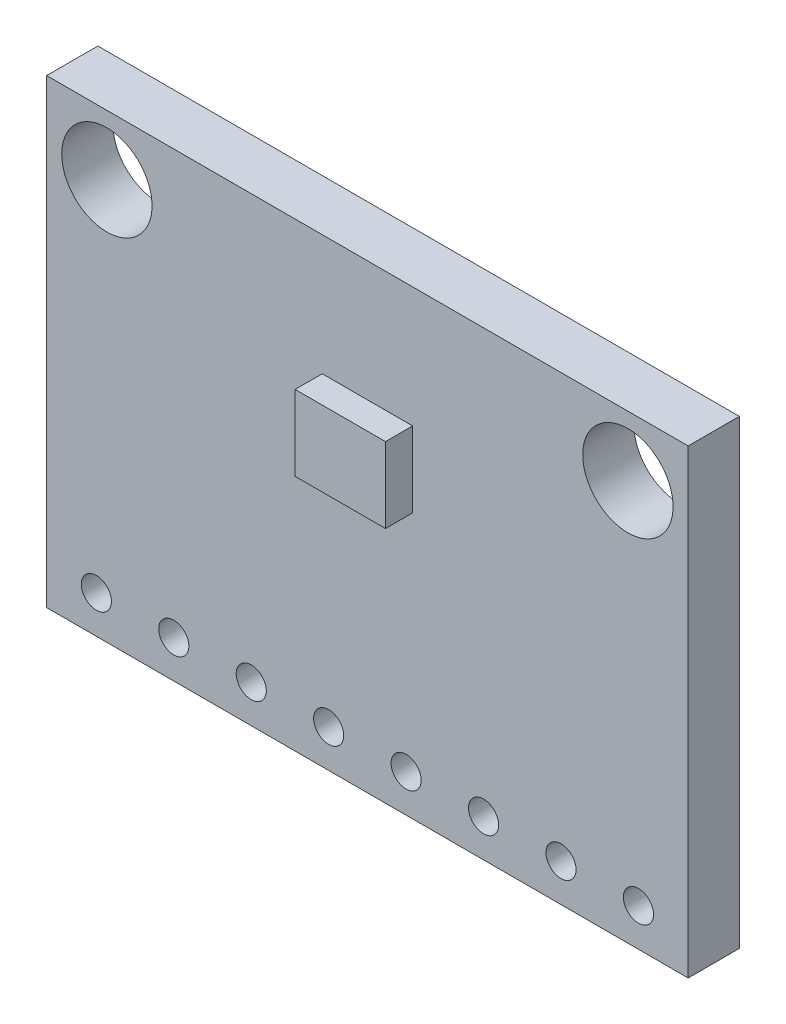
ISO-10303-21;
HEADER;
FILE_DESCRIPTION(('STEP AP214'),'2;1');
FILE_NAME('part.step','',(''),(''),'','','');
FILE_SCHEMA(('AUTOMOTIVE_DESIGN { 1 0 10303 214 1 1 1 1 }'));
ENDSEC;
DATA;
#1=APPLICATION_CONTEXT('core data for automotive mechanical design processes');
#2=APPLICATION_PROTOCOL_DEFINITION('international standard','automotive_design',2000,#1);
#3=PRODUCT_CONTEXT('',#1,'mechanical');
#4=PRODUCT('Part','Part','',(#3));
#5=PRODUCT_RELATED_PRODUCT_CATEGORY('part','',(#4));
#6=PRODUCT_DEFINITION_FORMATION('','',#4);
#7=PRODUCT_DEFINITION_CONTEXT('part definition',#1,'design');
#8=PRODUCT_DEFINITION('design','',#6,#7);
#9=PRODUCT_DEFINITION_SHAPE('','',#8);
#10=(LENGTH_UNIT() NAMED_UNIT(*) SI_UNIT(.MILLI.,.METRE.));
#11=(NAMED_UNIT(*) PLANE_ANGLE_UNIT() SI_UNIT($,.RADIAN.));
#12=(NAMED_UNIT(*) SI_UNIT($,.STERADIAN.) SOLID_ANGLE_UNIT());
#13=UNCERTAINTY_MEASURE_WITH_UNIT(LENGTH_MEASURE(1.E-05),#10,'distance_accuracy_value','');
#14=(GEOMETRIC_REPRESENTATION_CONTEXT(3) GLOBAL_UNCERTAINTY_ASSIGNED_CONTEXT((#13)) GLOBAL_UNIT_ASSIGNED_CONTEXT((#10,
#11,#12)) REPRESENTATION_CONTEXT('',''));
#15=CARTESIAN_POINT('',(0.,0.,0.));
#16=DIRECTION('',(0.,0.,1.));
#17=DIRECTION('',(1.,0.,0.));
#18=AXIS2_PLACEMENT_3D('',#15,#16,#17);
#19=CARTESIAN_POINT('',(0.,0.,1.7));
#20=DIRECTION('',(0.,0.,-1.));
#21=DIRECTION('',(-1.,0.,0.));
#22=AXIS2_PLACEMENT_3D('',#19,#20,#21);
#23=PLANE('',#22);
#24=CARTESIAN_POINT('',(6.42857142857143,-6.4,1.7));
#25=DIRECTION('',(0.,0.,-1.));
#26=DIRECTION('',(-1.,0.,0.));
#27=AXIS2_PLACEMENT_3D('',#24,#25,#26);
#28=CIRCLE('',#27,0.500000000000002);
#29=CARTESIAN_POINT('',(5.92857142857143,-6.4,1.7));
#30=VERTEX_POINT('',#29);
#31=EDGE_CURVE('E247',#30,#30,#28,.F.);
#32=ORIENTED_EDGE('',*,*,#31,.F.);
#33=EDGE_LOOP('',(#32));
#34=FACE_BOUND('',#33,.T.);
#35=CARTESIAN_POINT('',(1.28571428571429,-6.4,1.7));
#36=DIRECTION('',(0.,0.,-1.));
#37=DIRECTION('',(-1.,0.,0.));
#38=AXIS2_PLACEMENT_3D('',#35,#36,#37);
#39=CIRCLE('',#38,0.500000000000001);
#40=CARTESIAN_POINT('',(0.785714285714285,-6.4,1.7));
#41=VERTEX_POINT('',#40);
#42=EDGE_CURVE('E242',#41,#41,#39,.F.);
#43=ORIENTED_EDGE('',*,*,#42,.F.);
#44=EDGE_LOOP('',(#43));
#45=FACE_BOUND('',#44,.T.);
#46=CARTESIAN_POINT('',(-1.28571428571429,-6.4,1.7));
#47=DIRECTION('',(0.,0.,-1.));
#48=DIRECTION('',(-1.,0.,0.));
#49=AXIS2_PLACEMENT_3D('',#46,#47,#48);
#50=CIRCLE('',#49,0.500000000000001);
#51=CARTESIAN_POINT('',(-1.78571428571429,-6.4,1.7));
#52=VERTEX_POINT('',#51);
#53=EDGE_CURVE('E239',#52,#52,#50,.F.);
#54=ORIENTED_EDGE('',*,*,#53,.F.);
#55=EDGE_LOOP('',(#54));
#56=FACE_BOUND('',#55,.T.);
#57=CARTESIAN_POINT('',(-3.85714285714286,-6.4,1.7));
#58=DIRECTION('',(0.,0.,-1.));
#59=DIRECTION('',(-1.,0.,0.));
#60=AXIS2_PLACEMENT_3D('',#57,#58,#59);
#61=CIRCLE('',#60,0.500000000000001);
#62=CARTESIAN_POINT('',(-4.35714285714286,-6.4,1.7));
#63=VERTEX_POINT('',#62);
#64=EDGE_CURVE('E235',#63,#63,#61,.F.);
#65=ORIENTED_EDGE('',*,*,#64,.F.);
#66=EDGE_LOOP('',(#65));
#67=FACE_BOUND('',#66,.T.);
#68=CARTESIAN_POINT('',(-6.42857142857143,-6.4,1.7));
#69=DIRECTION('',(0.,0.,-1.));
#70=DIRECTION('',(-1.,0.,0.));
#71=AXIS2_PLACEMENT_3D('',#68,#69,#70);
#72=CIRCLE('',#71,0.500000000000002);
#73=CARTESIAN_POINT('',(-6.92857142857143,-6.4,1.7));
#74=VERTEX_POINT('',#73);
#75=EDGE_CURVE('E229',#74,#74,#72,.F.);
#76=ORIENTED_EDGE('',*,*,#75,.F.);
#77=EDGE_LOOP('',(#76));
#78=FACE_BOUND('',#77,.T.);
#79=CARTESIAN_POINT('',(-9.,-6.4,1.7));
#80=DIRECTION('',(0.,0.,-1.));
#81=DIRECTION('',(-1.,0.,0.));
#82=AXIS2_PLACEMENT_3D('',#79,#80,#81);
#83=CIRCLE('',#82,0.500000000000003);
#84=CARTESIAN_POINT('',(-9.5,-6.4,1.7));
#85=VERTEX_POINT('',#84);
#86=EDGE_CURVE('E225',#85,#85,#83,.F.);
#87=ORIENTED_EDGE('',*,*,#86,.F.);
#88=EDGE_LOOP('',(#87));
#89=FACE_BOUND('',#88,.T.);
#90=DIRECTION('',(0.,-1.,0.));
#91=VECTOR('',#90,1.);
#92=CARTESIAN_POINT('',(-1.5,0.,1.7));
#93=LINE('',#92,#91);
#94=CARTESIAN_POINT('',(-1.5,3.65,1.7));
#95=VERTEX_POINT('',#94);
#96=CARTESIAN_POINT('',(-1.5,1.15,1.7));
#97=VERTEX_POINT('',#96);
#98=EDGE_CURVE('E67',#95,#97,#93,.T.);
#99=ORIENTED_EDGE('',*,*,#98,.F.);
#100=DIRECTION('',(1.,0.,0.));
#101=VECTOR('',#100,1.);
#102=CARTESIAN_POINT('',(0.,3.65,1.7));
#103=LINE('',#102,#101);
#104=CARTESIAN_POINT('',(1.5,3.65,1.7));
#105=VERTEX_POINT('',#104);
#106=EDGE_CURVE('E75',#95,#105,#103,.T.);
#107=ORIENTED_EDGE('',*,*,#106,.T.);
#108=DIRECTION('',(0.,-1.,0.));
#109=VECTOR('',#108,1.);
#110=CARTESIAN_POINT('',(1.5,0.,1.7));
#111=LINE('',#110,#109);
#112=CARTESIAN_POINT('',(1.5,1.15,1.7));
#113=VERTEX_POINT('',#112);
#114=EDGE_CURVE('E261',#105,#113,#111,.T.);
#115=ORIENTED_EDGE('',*,*,#114,.T.);
#116=DIRECTION('',(1.,0.,0.));
#117=VECTOR('',#116,1.);
#118=CARTESIAN_POINT('',(0.,1.15,1.7));
#119=LINE('',#118,#117);
#120=EDGE_CURVE('E256',#97,#113,#119,.T.);
#121=ORIENTED_EDGE('',*,*,#120,.F.);
#122=EDGE_LOOP('',(#99,#107,#115,#121));
#123=FACE_BOUND('',#122,.T.);
#124=DIRECTION('',(1.,0.,0.));
#125=VECTOR('',#124,1.);
#126=CARTESIAN_POINT('',(-10.65,7.65,1.7));
#127=LINE('',#126,#125);
#128=CARTESIAN_POINT('',(-10.65,7.65,1.7));
#129=VERTEX_POINT('',#128);
#130=CARTESIAN_POINT('',(10.65,7.65,1.7));
#131=VERTEX_POINT('',#130);
#132=EDGE_CURVE('E151',#129,#131,#127,.T.);
#133=ORIENTED_EDGE('',*,*,#132,.F.);
#134=DIRECTION('',(0.,-1.,0.));
#135=VECTOR('',#134,1.);
#136=CARTESIAN_POINT('',(-10.65,7.65,1.7));
#137=LINE('',#136,#135);
#138=CARTESIAN_POINT('',(-10.65,-7.65,1.7));
#139=VERTEX_POINT('',#138);
#140=EDGE_CURVE('E162',#129,#139,#137,.T.);
#141=ORIENTED_EDGE('',*,*,#140,.T.);
#142=DIRECTION('',(1.,0.,0.));
#143=VECTOR('',#142,1.);
#144=CARTESIAN_POINT('',(-10.65,-7.65,1.7));
#145=LINE('',#144,#143);
#146=CARTESIAN_POINT('',(10.65,-7.65,1.7));
#147=VERTEX_POINT('',#146);
#148=EDGE_CURVE('E159',#139,#147,#145,.T.);
#149=ORIENTED_EDGE('',*,*,#148,.T.);
#150=DIRECTION('',(0.,-1.,0.));
#151=VECTOR('',#150,1.);
#152=CARTESIAN_POINT('',(10.65,7.65,1.7));
#153=LINE('',#152,#151);
#154=EDGE_CURVE('E154',#131,#147,#153,.T.);
#155=ORIENTED_EDGE('',*,*,#154,.F.);
#156=EDGE_LOOP('',(#133,#141,#149,#155));
#157=FACE_BOUND('',#156,.T.);
#158=CARTESIAN_POINT('',(3.85714285714286,-6.4,1.7));
#159=DIRECTION('',(0.,0.,-1.));
#160=DIRECTION('',(-1.,0.,0.));
#161=AXIS2_PLACEMENT_3D('',#158,#159,#160);
#162=CIRCLE('',#161,0.500000000000001);
#163=CARTESIAN_POINT('',(3.35714285714286,-6.4,1.7));
#164=VERTEX_POINT('',#163);
#165=EDGE_CURVE('E208',#164,#164,#162,.F.);
#166=ORIENTED_EDGE('',*,*,#165,.F.);
#167=EDGE_LOOP('',(#166));
#168=FACE_BOUND('',#167,.T.);
#169=CARTESIAN_POINT('',(9.,-6.4,1.7));
#170=DIRECTION('',(0.,0.,-1.));
#171=DIRECTION('',(-1.,0.,0.));
#172=AXIS2_PLACEMENT_3D('',#169,#170,#171);
#173=CIRCLE('',#172,0.500000000000003);
#174=CARTESIAN_POINT('',(8.5,-6.4,1.7));
#175=VERTEX_POINT('',#174);
#176=EDGE_CURVE('E215',#175,#175,#173,.F.);
#177=ORIENTED_EDGE('',*,*,#176,.F.);
#178=EDGE_LOOP('',(#177));
#179=FACE_BOUND('',#178,.T.);
#180=CARTESIAN_POINT('',(-8.65,5.65,1.7));
#181=DIRECTION('',(0.,0.,-1.));
#182=DIRECTION('',(-1.,0.,0.));
#183=AXIS2_PLACEMENT_3D('',#180,#181,#182);
#184=CIRCLE('',#183,1.5);
#185=CARTESIAN_POINT('',(-10.15,5.65,1.7));
#186=VERTEX_POINT('',#185);
#187=EDGE_CURVE('E216',#186,#186,#184,.F.);
#188=ORIENTED_EDGE('',*,*,#187,.F.);
#189=EDGE_LOOP('',(#188));
#190=FACE_BOUND('',#189,.T.);
#191=CARTESIAN_POINT('',(8.65,5.65,1.7));
#192=DIRECTION('',(0.,0.,-1.));
#193=DIRECTION('',(-1.,0.,0.));
#194=AXIS2_PLACEMENT_3D('',#191,#192,#193);
#195=CIRCLE('',#194,1.5);
#196=CARTESIAN_POINT('',(7.15,5.65,1.7));
#197=VERTEX_POINT('',#196);
#198=EDGE_CURVE('E218',#197,#197,#195,.T.);
#199=ORIENTED_EDGE('',*,*,#198,.T.);
#200=EDGE_LOOP('',(#199));
#201=FACE_BOUND('',#200,.T.);
#202=ADVANCED_FACE('F47',(#34,#45,#56,#67,#78,#89,#123,#157,#168,#179,#190,#201),#23,.F.);
#203=CARTESIAN_POINT('',(0.,0.,0.));
#204=DIRECTION('',(0.,0.,-1.));
#205=DIRECTION('',(-1.,0.,0.));
#206=AXIS2_PLACEMENT_3D('',#203,#204,#205);
#207=PLANE('',#206);
#208=CARTESIAN_POINT('',(6.42857142857143,-6.4,0.));
#209=DIRECTION('',(0.,0.,1.));
#210=DIRECTION('',(1.,0.,0.));
#211=AXIS2_PLACEMENT_3D('',#208,#209,#210);
#212=CIRCLE('',#211,0.500000000000002);
#213=CARTESIAN_POINT('',(6.92857142857143,-6.4,0.));
#214=VERTEX_POINT('',#213);
#215=EDGE_CURVE('E447',#214,#214,#212,.T.);
#216=ORIENTED_EDGE('',*,*,#215,.T.);
#217=EDGE_LOOP('',(#216));
#218=FACE_BOUND('',#217,.T.);
#219=CARTESIAN_POINT('',(1.28571428571429,-6.4,0.));
#220=DIRECTION('',(0.,0.,1.));
#221=DIRECTION('',(1.,0.,0.));
#222=AXIS2_PLACEMENT_3D('',#219,#220,#221);
#223=CIRCLE('',#222,0.500000000000001);
#224=CARTESIAN_POINT('',(1.78571428571429,-6.4,0.));
#225=VERTEX_POINT('',#224);
#226=EDGE_CURVE('E466',#225,#225,#223,.T.);
#227=ORIENTED_EDGE('',*,*,#226,.T.);
#228=EDGE_LOOP('',(#227));
#229=FACE_BOUND('',#228,.T.);
#230=CARTESIAN_POINT('',(-1.28571428571429,-6.4,0.));
#231=DIRECTION('',(0.,0.,1.));
#232=DIRECTION('',(1.,0.,0.));
#233=AXIS2_PLACEMENT_3D('',#230,#231,#232);
#234=CIRCLE('',#233,0.500000000000001);
#235=CARTESIAN_POINT('',(-0.785714285714285,-6.4,0.));
#236=VERTEX_POINT('',#235);
#237=EDGE_CURVE('E472',#236,#236,#234,.T.);
#238=ORIENTED_EDGE('',*,*,#237,.T.);
#239=EDGE_LOOP('',(#238));
#240=FACE_BOUND('',#239,.T.);
#241=CARTESIAN_POINT('',(-3.85714285714286,-6.4,0.));
#242=DIRECTION('',(0.,0.,1.));
#243=DIRECTION('',(1.,0.,0.));
#244=AXIS2_PLACEMENT_3D('',#241,#242,#243);
#245=CIRCLE('',#244,0.500000000000001);
#246=CARTESIAN_POINT('',(-3.35714285714286,-6.4,0.));
#247=VERTEX_POINT('',#246);
#248=EDGE_CURVE('E494',#247,#247,#245,.T.);
#249=ORIENTED_EDGE('',*,*,#248,.T.);
#250=EDGE_LOOP('',(#249));
#251=FACE_BOUND('',#250,.T.);
#252=CARTESIAN_POINT('',(-6.42857142857143,-6.4,0.));
#253=DIRECTION('',(0.,0.,1.));
#254=DIRECTION('',(1.,0.,0.));
#255=AXIS2_PLACEMENT_3D('',#252,#253,#254);
#256=CIRCLE('',#255,0.500000000000002);
#257=CARTESIAN_POINT('',(-5.92857142857143,-6.4,0.));
#258=VERTEX_POINT('',#257);
#259=EDGE_CURVE('E491',#258,#258,#256,.T.);
#260=ORIENTED_EDGE('',*,*,#259,.T.);
#261=EDGE_LOOP('',(#260));
#262=FACE_BOUND('',#261,.T.);
#263=CARTESIAN_POINT('',(-9.,-6.4,0.));
#264=DIRECTION('',(0.,0.,1.));
#265=DIRECTION('',(1.,0.,0.));
#266=AXIS2_PLACEMENT_3D('',#263,#264,#265);
#267=CIRCLE('',#266,0.500000000000003);
#268=CARTESIAN_POINT('',(-8.5,-6.4,0.));
#269=VERTEX_POINT('',#268);
#270=EDGE_CURVE('E490',#269,#269,#267,.T.);
#271=ORIENTED_EDGE('',*,*,#270,.T.);
#272=EDGE_LOOP('',(#271));
#273=FACE_BOUND('',#272,.T.);
#274=CARTESIAN_POINT('',(-8.65,5.65,0.));
#275=DIRECTION('',(0.,0.,1.));
#276=DIRECTION('',(1.,0.,0.));
#277=AXIS2_PLACEMENT_3D('',#274,#275,#276);
#278=CIRCLE('',#277,1.5);
#279=CARTESIAN_POINT('',(-7.15,5.65,0.));
#280=VERTEX_POINT('',#279);
#281=EDGE_CURVE('E476',#280,#280,#278,.T.);
#282=ORIENTED_EDGE('',*,*,#281,.T.);
#283=EDGE_LOOP('',(#282));
#284=FACE_BOUND('',#283,.T.);
#285=CARTESIAN_POINT('',(9.,-6.4,0.));
#286=DIRECTION('',(0.,0.,1.));
#287=DIRECTION('',(1.,0.,0.));
#288=AXIS2_PLACEMENT_3D('',#285,#286,#287);
#289=CIRCLE('',#288,0.500000000000003);
#290=CARTESIAN_POINT('',(9.5,-6.4,0.));
#291=VERTEX_POINT('',#290);
#292=EDGE_CURVE('E467',#291,#291,#289,.T.);
#293=ORIENTED_EDGE('',*,*,#292,.T.);
#294=EDGE_LOOP('',(#293));
#295=FACE_BOUND('',#294,.T.);
#296=CARTESIAN_POINT('',(3.85714285714286,-6.4,0.));
#297=DIRECTION('',(0.,0.,1.));
#298=DIRECTION('',(1.,0.,0.));
#299=AXIS2_PLACEMENT_3D('',#296,#297,#298);
#300=CIRCLE('',#299,0.500000000000001);
#301=CARTESIAN_POINT('',(4.35714285714286,-6.4,0.));
#302=VERTEX_POINT('',#301);
#303=EDGE_CURVE('E485',#302,#302,#300,.T.);
#304=ORIENTED_EDGE('',*,*,#303,.T.);
#305=EDGE_LOOP('',(#304));
#306=FACE_BOUND('',#305,.T.);
#307=DIRECTION('',(1.,0.,0.));
#308=VECTOR('',#307,1.);
#309=CARTESIAN_POINT('',(-10.65,7.65,0.));
#310=LINE('',#309,#308);
#311=CARTESIAN_POINT('',(-10.65,7.65,0.));
#312=VERTEX_POINT('',#311);
#313=CARTESIAN_POINT('',(10.65,7.65,0.));
#314=VERTEX_POINT('',#313);
#315=EDGE_CURVE('E140',#312,#314,#310,.T.);
#316=ORIENTED_EDGE('',*,*,#315,.T.);
#317=DIRECTION('',(0.,-1.,0.));
#318=VECTOR('',#317,1.);
#319=CARTESIAN_POINT('',(10.65,7.65,0.));
#320=LINE('',#319,#318);
#321=CARTESIAN_POINT('',(10.65,-7.65,0.));
#322=VERTEX_POINT('',#321);
#323=EDGE_CURVE('E144',#314,#322,#320,.T.);
#324=ORIENTED_EDGE('',*,*,#323,.T.);
#325=DIRECTION('',(1.,0.,0.));
#326=VECTOR('',#325,1.);
#327=CARTESIAN_POINT('',(-10.65,-7.65,0.));
#328=LINE('',#327,#326);
#329=CARTESIAN_POINT('',(-10.65,-7.65,0.));
#330=VERTEX_POINT('',#329);
#331=EDGE_CURVE('E166',#330,#322,#328,.T.);
#332=ORIENTED_EDGE('',*,*,#331,.F.);
#333=DIRECTION('',(0.,-1.,0.));
#334=VECTOR('',#333,1.);
#335=CARTESIAN_POINT('',(-10.65,7.65,0.));
#336=LINE('',#335,#334);
#337=EDGE_CURVE('E156',#312,#330,#336,.T.);
#338=ORIENTED_EDGE('',*,*,#337,.F.);
#339=EDGE_LOOP('',(#316,#324,#332,#338));
#340=FACE_BOUND('',#339,.T.);
#341=CARTESIAN_POINT('',(8.65,5.65,0.));
#342=DIRECTION('',(0.,0.,-1.));
#343=DIRECTION('',(-1.,0.,0.));
#344=AXIS2_PLACEMENT_3D('',#341,#342,#343);
#345=CIRCLE('',#344,1.5);
#346=CARTESIAN_POINT('',(7.15,5.65,0.));
#347=VERTEX_POINT('',#346);
#348=EDGE_CURVE('E483',#347,#347,#345,.T.);
#349=ORIENTED_EDGE('',*,*,#348,.F.);
#350=EDGE_LOOP('',(#349));
#351=FACE_BOUND('',#350,.T.);
#352=ADVANCED_FACE('F191',(#218,#229,#240,#251,#262,#273,#284,#295,#306,#340,#351),#207,.T.);
#353=CARTESIAN_POINT('',(-10.65,7.65,1.7));
#354=DIRECTION('',(0.,1.,0.));
#355=DIRECTION('',(-1.,0.,0.));
#356=AXIS2_PLACEMENT_3D('',#353,#354,#355);
#357=PLANE('',#356);
#358=ORIENTED_EDGE('',*,*,#315,.F.);
#359=DIRECTION('',(0.,0.,-1.));
#360=VECTOR('',#359,1.);
#361=CARTESIAN_POINT('',(-10.65,7.65,1.7));
#362=LINE('',#361,#360);
#363=EDGE_CURVE('E11',#129,#312,#362,.T.);
#364=ORIENTED_EDGE('',*,*,#363,.F.);
#365=ORIENTED_EDGE('',*,*,#132,.T.);
#366=DIRECTION('',(0.,0.,-1.));
#367=VECTOR('',#366,1.);
#368=CARTESIAN_POINT('',(10.65,7.65,1.7));
#369=LINE('',#368,#367);
#370=EDGE_CURVE('E52',#131,#314,#369,.T.);
#371=ORIENTED_EDGE('',*,*,#370,.T.);
#372=EDGE_LOOP('',(#358,#364,#365,#371));
#373=FACE_BOUND('',#372,.T.);
#374=ADVANCED_FACE('F51',(#373),#357,.T.);
#375=CARTESIAN_POINT('',(-10.65,7.65,1.7));
#376=DIRECTION('',(1.,0.,0.));
#377=DIRECTION('',(0.,1.,0.));
#378=AXIS2_PLACEMENT_3D('',#375,#376,#377);
#379=PLANE('',#378);
#380=ORIENTED_EDGE('',*,*,#337,.T.);
#381=DIRECTION('',(0.,0.,-1.));
#382=VECTOR('',#381,1.);
#383=CARTESIAN_POINT('',(-10.65,-7.65,1.7));
#384=LINE('',#383,#382);
#385=EDGE_CURVE('E56',#139,#330,#384,.T.);
#386=ORIENTED_EDGE('',*,*,#385,.F.);
#387=ORIENTED_EDGE('',*,*,#140,.F.);
#388=ORIENTED_EDGE('',*,*,#363,.T.);
#389=EDGE_LOOP('',(#380,#386,#387,#388));
#390=FACE_BOUND('',#389,.T.);
#391=ADVANCED_FACE('F195',(#390),#379,.F.);
#392=CARTESIAN_POINT('',(-10.65,-7.65,1.7));
#393=DIRECTION('',(0.,1.,0.));
#394=DIRECTION('',(-1.,0.,0.));
#395=AXIS2_PLACEMENT_3D('',#392,#393,#394);
#396=PLANE('',#395);
#397=ORIENTED_EDGE('',*,*,#331,.T.);
#398=DIRECTION('',(0.,0.,-1.));
#399=VECTOR('',#398,1.);
#400=CARTESIAN_POINT('',(10.65,-7.65,1.7));
#401=LINE('',#400,#399);
#402=EDGE_CURVE('E177',#147,#322,#401,.T.);
#403=ORIENTED_EDGE('',*,*,#402,.F.);
#404=ORIENTED_EDGE('',*,*,#148,.F.);
#405=ORIENTED_EDGE('',*,*,#385,.T.);
#406=EDGE_LOOP('',(#397,#403,#404,#405));
#407=FACE_BOUND('',#406,.T.);
#408=ADVANCED_FACE('F200',(#407),#396,.F.);
#409=CARTESIAN_POINT('',(10.65,7.65,1.7));
#410=DIRECTION('',(1.,0.,0.));
#411=DIRECTION('',(0.,1.,0.));
#412=AXIS2_PLACEMENT_3D('',#409,#410,#411);
#413=PLANE('',#412);
#414=ORIENTED_EDGE('',*,*,#323,.F.);
#415=ORIENTED_EDGE('',*,*,#370,.F.);
#416=ORIENTED_EDGE('',*,*,#154,.T.);
#417=ORIENTED_EDGE('',*,*,#402,.T.);
#418=EDGE_LOOP('',(#414,#415,#416,#417));
#419=FACE_BOUND('',#418,.T.);
#420=ADVANCED_FACE('F189',(#419),#413,.T.);
#421=CARTESIAN_POINT('',(-1.5,0.,2.6));
#422=DIRECTION('',(1.,0.,0.));
#423=DIRECTION('',(0.,0.,-1.));
#424=AXIS2_PLACEMENT_3D('',#421,#422,#423);
#425=PLANE('',#424);
#426=ORIENTED_EDGE('',*,*,#98,.T.);
#427=DIRECTION('',(0.,0.,-1.));
#428=VECTOR('',#427,1.);
#429=CARTESIAN_POINT('',(-1.5,1.15,2.6));
#430=LINE('',#429,#428);
#431=CARTESIAN_POINT('',(-1.5,1.15,2.6));
#432=VERTEX_POINT('',#431);
#433=EDGE_CURVE('E116',#432,#97,#430,.T.);
#434=ORIENTED_EDGE('',*,*,#433,.F.);
#435=DIRECTION('',(0.,-1.,0.));
#436=VECTOR('',#435,1.);
#437=CARTESIAN_POINT('',(-1.5,0.,2.6));
#438=LINE('',#437,#436);
#439=CARTESIAN_POINT('',(-1.5,3.65,2.6));
#440=VERTEX_POINT('',#439);
#441=EDGE_CURVE('E126',#440,#432,#438,.T.);
#442=ORIENTED_EDGE('',*,*,#441,.F.);
#443=DIRECTION('',(0.,0.,-1.));
#444=VECTOR('',#443,1.);
#445=CARTESIAN_POINT('',(-1.5,3.65,2.6));
#446=LINE('',#445,#444);
#447=EDGE_CURVE('E254',#440,#95,#446,.T.);
#448=ORIENTED_EDGE('',*,*,#447,.T.);
#449=EDGE_LOOP('',(#426,#434,#442,#448));
#450=FACE_BOUND('',#449,.T.);
#451=ADVANCED_FACE('F139',(#450),#425,.F.);
#452=CARTESIAN_POINT('',(0.,1.15,2.6));
#453=DIRECTION('',(0.,1.,0.));
#454=DIRECTION('',(-1.,0.,0.));
#455=AXIS2_PLACEMENT_3D('',#452,#453,#454);
#456=PLANE('',#455);
#457=ORIENTED_EDGE('',*,*,#120,.T.);
#458=DIRECTION('',(0.,0.,-1.));
#459=VECTOR('',#458,1.);
#460=CARTESIAN_POINT('',(1.5,1.15,2.6));
#461=LINE('',#460,#459);
#462=CARTESIAN_POINT('',(1.5,1.15,2.6));
#463=VERTEX_POINT('',#462);
#464=EDGE_CURVE('E122',#463,#113,#461,.T.);
#465=ORIENTED_EDGE('',*,*,#464,.F.);
#466=DIRECTION('',(1.,0.,0.));
#467=VECTOR('',#466,1.);
#468=CARTESIAN_POINT('',(0.,1.15,2.6));
#469=LINE('',#468,#467);
#470=EDGE_CURVE('E113',#432,#463,#469,.T.);
#471=ORIENTED_EDGE('',*,*,#470,.F.);
#472=ORIENTED_EDGE('',*,*,#433,.T.);
#473=EDGE_LOOP('',(#457,#465,#471,#472));
#474=FACE_BOUND('',#473,.T.);
#475=ADVANCED_FACE('F117',(#474),#456,.F.);
#476=CARTESIAN_POINT('',(1.5,0.,2.6));
#477=DIRECTION('',(1.,0.,0.));
#478=DIRECTION('',(0.,1.,0.));
#479=AXIS2_PLACEMENT_3D('',#476,#477,#478);
#480=PLANE('',#479);
#481=ORIENTED_EDGE('',*,*,#114,.F.);
#482=DIRECTION('',(0.,0.,-1.));
#483=VECTOR('',#482,1.);
#484=CARTESIAN_POINT('',(1.5,3.65,2.6));
#485=LINE('',#484,#483);
#486=CARTESIAN_POINT('',(1.5,3.65,2.6));
#487=VERTEX_POINT('',#486);
#488=EDGE_CURVE('E150',#487,#105,#485,.T.);
#489=ORIENTED_EDGE('',*,*,#488,.F.);
#490=DIRECTION('',(0.,-1.,0.));
#491=VECTOR('',#490,1.);
#492=CARTESIAN_POINT('',(1.5,0.,2.6));
#493=LINE('',#492,#491);
#494=EDGE_CURVE('E130',#487,#463,#493,.T.);
#495=ORIENTED_EDGE('',*,*,#494,.T.);
#496=ORIENTED_EDGE('',*,*,#464,.T.);
#497=EDGE_LOOP('',(#481,#489,#495,#496));
#498=FACE_BOUND('',#497,.T.);
#499=ADVANCED_FACE('F275',(#498),#480,.T.);
#500=CARTESIAN_POINT('',(0.,3.65,2.6));
#501=DIRECTION('',(0.,1.,0.));
#502=DIRECTION('',(-1.,0.,0.));
#503=AXIS2_PLACEMENT_3D('',#500,#501,#502);
#504=PLANE('',#503);
#505=ORIENTED_EDGE('',*,*,#106,.F.);
#506=ORIENTED_EDGE('',*,*,#447,.F.);
#507=DIRECTION('',(1.,0.,0.));
#508=VECTOR('',#507,1.);
#509=CARTESIAN_POINT('',(0.,3.65,2.6));
#510=LINE('',#509,#508);
#511=EDGE_CURVE('E135',#440,#487,#510,.T.);
#512=ORIENTED_EDGE('',*,*,#511,.T.);
#513=ORIENTED_EDGE('',*,*,#488,.T.);
#514=EDGE_LOOP('',(#505,#506,#512,#513));
#515=FACE_BOUND('',#514,.T.);
#516=ADVANCED_FACE('F269',(#515),#504,.T.);
#517=CARTESIAN_POINT('',(0.,0.,2.6));
#518=DIRECTION('',(0.,0.,1.));
#519=DIRECTION('',(1.,0.,0.));
#520=AXIS2_PLACEMENT_3D('',#517,#518,#519);
#521=PLANE('',#520);
#522=ORIENTED_EDGE('',*,*,#441,.T.);
#523=ORIENTED_EDGE('',*,*,#470,.T.);
#524=ORIENTED_EDGE('',*,*,#494,.F.);
#525=ORIENTED_EDGE('',*,*,#511,.F.);
#526=EDGE_LOOP('',(#522,#523,#524,#525));
#527=FACE_BOUND('',#526,.T.);
#528=ADVANCED_FACE('F134',(#527),#521,.T.);
#529=CARTESIAN_POINT('',(3.85714285714286,-6.4,2.6));
#530=DIRECTION('',(0.,0.,-1.));
#531=DIRECTION('',(-1.,0.,0.));
#532=AXIS2_PLACEMENT_3D('',#529,#530,#531);
#533=CYLINDRICAL_SURFACE('',#532,0.500000000000001);
#534=ORIENTED_EDGE('',*,*,#303,.F.);
#535=EDGE_LOOP('',(#534));
#536=FACE_BOUND('',#535,.T.);
#537=ORIENTED_EDGE('',*,*,#165,.T.);
#538=EDGE_LOOP('',(#537));
#539=FACE_BOUND('',#538,.T.);
#540=ADVANCED_FACE('F325',(#536,#539),#533,.F.);
#541=CARTESIAN_POINT('',(9.,-6.4,2.6));
#542=DIRECTION('',(0.,0.,-1.));
#543=DIRECTION('',(-1.,0.,0.));
#544=AXIS2_PLACEMENT_3D('',#541,#542,#543);
#545=CYLINDRICAL_SURFACE('',#544,0.500000000000003);
#546=ORIENTED_EDGE('',*,*,#292,.F.);
#547=EDGE_LOOP('',(#546));
#548=FACE_BOUND('',#547,.T.);
#549=ORIENTED_EDGE('',*,*,#176,.T.);
#550=EDGE_LOOP('',(#549));
#551=FACE_BOUND('',#550,.T.);
#552=ADVANCED_FACE('F349',(#548,#551),#545,.F.);
#553=CARTESIAN_POINT('',(-8.65,5.65,2.6));
#554=DIRECTION('',(0.,0.,-1.));
#555=DIRECTION('',(-1.,0.,0.));
#556=AXIS2_PLACEMENT_3D('',#553,#554,#555);
#557=CYLINDRICAL_SURFACE('',#556,1.5);
#558=ORIENTED_EDGE('',*,*,#281,.F.);
#559=EDGE_LOOP('',(#558));
#560=FACE_BOUND('',#559,.T.);
#561=ORIENTED_EDGE('',*,*,#187,.T.);
#562=EDGE_LOOP('',(#561));
#563=FACE_BOUND('',#562,.T.);
#564=ADVANCED_FACE('F359',(#560,#563),#557,.F.);
#565=CARTESIAN_POINT('',(8.65,5.65,2.6));
#566=DIRECTION('',(0.,0.,-1.));
#567=DIRECTION('',(-1.,0.,0.));
#568=AXIS2_PLACEMENT_3D('',#565,#566,#567);
#569=CYLINDRICAL_SURFACE('',#568,1.5);
#570=ORIENTED_EDGE('',*,*,#348,.T.);
#571=EDGE_LOOP('',(#570));
#572=FACE_BOUND('',#571,.T.);
#573=ORIENTED_EDGE('',*,*,#198,.F.);
#574=EDGE_LOOP('',(#573));
#575=FACE_BOUND('',#574,.T.);
#576=ADVANCED_FACE('F370',(#572,#575),#569,.F.);
#577=CARTESIAN_POINT('',(-9.,-6.4,2.6));
#578=DIRECTION('',(0.,0.,-1.));
#579=DIRECTION('',(-1.,0.,0.));
#580=AXIS2_PLACEMENT_3D('',#577,#578,#579);
#581=CYLINDRICAL_SURFACE('',#580,0.500000000000003);
#582=ORIENTED_EDGE('',*,*,#270,.F.);
#583=EDGE_LOOP('',(#582));
#584=FACE_BOUND('',#583,.T.);
#585=ORIENTED_EDGE('',*,*,#86,.T.);
#586=EDGE_LOOP('',(#585));
#587=FACE_BOUND('',#586,.T.);
#588=ADVANCED_FACE('F376',(#584,#587),#581,.F.);
#589=CARTESIAN_POINT('',(-6.42857142857143,-6.4,2.6));
#590=DIRECTION('',(0.,0.,-1.));
#591=DIRECTION('',(-1.,0.,0.));
#592=AXIS2_PLACEMENT_3D('',#589,#590,#591);
#593=CYLINDRICAL_SURFACE('',#592,0.500000000000002);
#594=ORIENTED_EDGE('',*,*,#259,.F.);
#595=EDGE_LOOP('',(#594));
#596=FACE_BOUND('',#595,.T.);
#597=ORIENTED_EDGE('',*,*,#75,.T.);
#598=EDGE_LOOP('',(#597));
#599=FACE_BOUND('',#598,.T.);
#600=ADVANCED_FACE('F384',(#596,#599),#593,.F.);
#601=CARTESIAN_POINT('',(-3.85714285714286,-6.4,2.6));
#602=DIRECTION('',(0.,0.,-1.));
#603=DIRECTION('',(-1.,0.,0.));
#604=AXIS2_PLACEMENT_3D('',#601,#602,#603);
#605=CYLINDRICAL_SURFACE('',#604,0.500000000000001);
#606=ORIENTED_EDGE('',*,*,#248,.F.);
#607=EDGE_LOOP('',(#606));
#608=FACE_BOUND('',#607,.T.);
#609=ORIENTED_EDGE('',*,*,#64,.T.);
#610=EDGE_LOOP('',(#609));
#611=FACE_BOUND('',#610,.T.);
#612=ADVANCED_FACE('F395',(#608,#611),#605,.F.);
#613=CARTESIAN_POINT('',(-1.28571428571429,-6.4,2.6));
#614=DIRECTION('',(0.,0.,-1.));
#615=DIRECTION('',(-1.,0.,0.));
#616=AXIS2_PLACEMENT_3D('',#613,#614,#615);
#617=CYLINDRICAL_SURFACE('',#616,0.500000000000001);
#618=ORIENTED_EDGE('',*,*,#237,.F.);
#619=EDGE_LOOP('',(#618));
#620=FACE_BOUND('',#619,.T.);
#621=ORIENTED_EDGE('',*,*,#53,.T.);
#622=EDGE_LOOP('',(#621));
#623=FACE_BOUND('',#622,.T.);
#624=ADVANCED_FACE('F401',(#620,#623),#617,.F.);
#625=CARTESIAN_POINT('',(1.28571428571429,-6.4,2.6));
#626=DIRECTION('',(0.,0.,-1.));
#627=DIRECTION('',(-1.,0.,0.));
#628=AXIS2_PLACEMENT_3D('',#625,#626,#627);
#629=CYLINDRICAL_SURFACE('',#628,0.500000000000001);
#630=ORIENTED_EDGE('',*,*,#226,.F.);
#631=EDGE_LOOP('',(#630));
#632=FACE_BOUND('',#631,.T.);
#633=ORIENTED_EDGE('',*,*,#42,.T.);
#634=EDGE_LOOP('',(#633));
#635=FACE_BOUND('',#634,.T.);
#636=ADVANCED_FACE('F412',(#632,#635),#629,.F.);
#637=CARTESIAN_POINT('',(6.42857142857143,-6.4,2.6));
#638=DIRECTION('',(0.,0.,-1.));
#639=DIRECTION('',(-1.,0.,0.));
#640=AXIS2_PLACEMENT_3D('',#637,#638,#639);
#641=CYLINDRICAL_SURFACE('',#640,0.500000000000002);
#642=ORIENTED_EDGE('',*,*,#215,.F.);
#643=EDGE_LOOP('',(#642));
#644=FACE_BOUND('',#643,.T.);
#645=ORIENTED_EDGE('',*,*,#31,.T.);
#646=EDGE_LOOP('',(#645));
#647=FACE_BOUND('',#646,.T.);
#648=ADVANCED_FACE('F423',(#644,#647),#641,.F.);
#649=CLOSED_SHELL('',(#202,#352,#374,#391,#408,#420,#451,#475,#499,#516,#528,#540,#552,#564,
#576,#588,#600,#612,#624,#636,#648));
#650=MANIFOLD_SOLID_BREP('B2',#649);
#651=ADVANCED_BREP_SHAPE_REPRESENTATION('',(#18,#650),#14);
#652=SHAPE_DEFINITION_REPRESENTATION(#9,#651);
ENDSEC;
END-ISO-10303-21;
